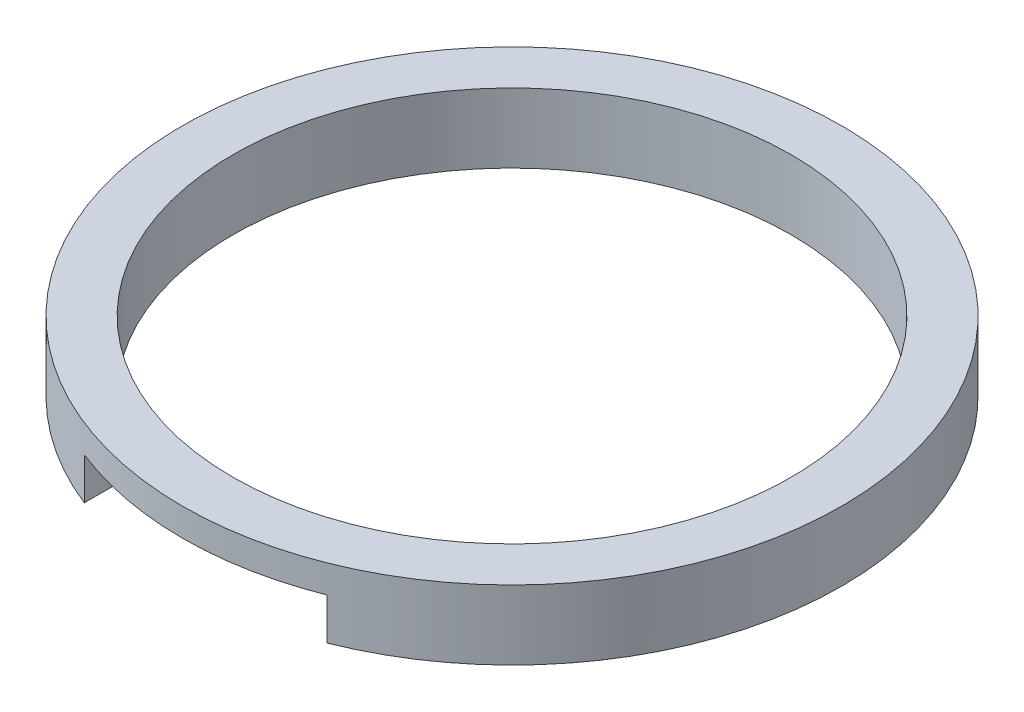
ISO-10303-21;
HEADER;
FILE_DESCRIPTION(('STEP AP214'),'2;1');
FILE_NAME('part.step','',(''),(''),'','','');
FILE_SCHEMA(('AUTOMOTIVE_DESIGN { 1 0 10303 214 1 1 1 1 }'));
ENDSEC;
DATA;
#1=APPLICATION_CONTEXT('core data for automotive mechanical design processes');
#2=APPLICATION_PROTOCOL_DEFINITION('international standard','automotive_design',2000,#1);
#3=PRODUCT_CONTEXT('',#1,'mechanical');
#4=PRODUCT('Part','Part','',(#3));
#5=PRODUCT_RELATED_PRODUCT_CATEGORY('part','',(#4));
#6=PRODUCT_DEFINITION_FORMATION('','',#4);
#7=PRODUCT_DEFINITION_CONTEXT('part definition',#1,'design');
#8=PRODUCT_DEFINITION('design','',#6,#7);
#9=PRODUCT_DEFINITION_SHAPE('','',#8);
#10=(LENGTH_UNIT() NAMED_UNIT(*) SI_UNIT(.MILLI.,.METRE.));
#11=(NAMED_UNIT(*) PLANE_ANGLE_UNIT() SI_UNIT($,.RADIAN.));
#12=(NAMED_UNIT(*) SI_UNIT($,.STERADIAN.) SOLID_ANGLE_UNIT());
#13=UNCERTAINTY_MEASURE_WITH_UNIT(LENGTH_MEASURE(1.E-05),#10,'distance_accuracy_value','');
#14=(GEOMETRIC_REPRESENTATION_CONTEXT(3) GLOBAL_UNCERTAINTY_ASSIGNED_CONTEXT((#13)) GLOBAL_UNIT_ASSIGNED_CONTEXT((#10,
#11,#12)) REPRESENTATION_CONTEXT('',''));
#15=CARTESIAN_POINT('',(0.,0.,0.));
#16=DIRECTION('',(0.,0.,1.));
#17=DIRECTION('',(1.,0.,0.));
#18=AXIS2_PLACEMENT_3D('',#15,#16,#17);
#19=CARTESIAN_POINT('',(0.,2.,0.));
#20=DIRECTION('',(0.,-1.,0.));
#21=DIRECTION('',(0.,0.,-1.));
#22=AXIS2_PLACEMENT_3D('',#19,#20,#21);
#23=CYLINDRICAL_SURFACE('',#22,9.5);
#24=CARTESIAN_POINT('',(0.,2.,0.));
#25=DIRECTION('',(0.,1.,0.));
#26=DIRECTION('',(0.,0.,1.));
#27=AXIS2_PLACEMENT_3D('',#24,#25,#26);
#28=CIRCLE('',#27,9.5);
#29=CARTESIAN_POINT('',(0.,2.,9.5));
#30=VERTEX_POINT('',#29);
#31=EDGE_CURVE('E11',#30,#30,#28,.T.);
#32=ORIENTED_EDGE('',*,*,#31,.F.);
#33=EDGE_LOOP('',(#32));
#34=FACE_BOUND('',#33,.T.);
#35=CARTESIAN_POINT('',(0.,1.2,0.));
#36=DIRECTION('',(0.,-1.,0.));
#37=DIRECTION('',(0.,0.,-1.));
#38=AXIS2_PLACEMENT_3D('',#35,#36,#37);
#39=CIRCLE('',#38,9.5);
#40=CARTESIAN_POINT('',(3.5,1.2,8.83176086632785));
#41=VERTEX_POINT('',#40);
#42=CARTESIAN_POINT('',(-3.5,1.2,8.83176086632785));
#43=VERTEX_POINT('',#42);
#44=EDGE_CURVE('E81',#41,#43,#39,.T.);
#45=ORIENTED_EDGE('',*,*,#44,.F.);
#46=DIRECTION('',(0.,-1.,0.));
#47=VECTOR('',#46,1.);
#48=CARTESIAN_POINT('',(3.5,1.2,8.83176086632785));
#49=LINE('',#48,#47);
#50=CARTESIAN_POINT('',(3.5,0.,8.83176086632785));
#51=VERTEX_POINT('',#50);
#52=EDGE_CURVE('E55',#41,#51,#49,.T.);
#53=ORIENTED_EDGE('',*,*,#52,.T.);
#54=CARTESIAN_POINT('',(0.,0.,0.));
#55=DIRECTION('',(0.,1.,0.));
#56=DIRECTION('',(0.,0.,1.));
#57=AXIS2_PLACEMENT_3D('',#54,#55,#56);
#58=CIRCLE('',#57,9.5);
#59=CARTESIAN_POINT('',(-3.5,0.,8.83176086632785));
#60=VERTEX_POINT('',#59);
#61=EDGE_CURVE('E35',#51,#60,#58,.T.);
#62=ORIENTED_EDGE('',*,*,#61,.T.);
#63=DIRECTION('',(0.,-1.,0.));
#64=VECTOR('',#63,1.);
#65=CARTESIAN_POINT('',(-3.5,1.2,8.83176086632785));
#66=LINE('',#65,#64);
#67=EDGE_CURVE('E75',#43,#60,#66,.T.);
#68=ORIENTED_EDGE('',*,*,#67,.F.);
#69=EDGE_LOOP('',(#45,#53,#62,#68));
#70=FACE_BOUND('',#69,.T.);
#71=ADVANCED_FACE('F32',(#34,#70),#23,.T.);
#72=CARTESIAN_POINT('',(0.,2.,0.));
#73=DIRECTION('',(0.,1.,0.));
#74=DIRECTION('',(0.,0.,1.));
#75=AXIS2_PLACEMENT_3D('',#72,#73,#74);
#76=PLANE('',#75);
#77=CARTESIAN_POINT('',(0.,2.,0.));
#78=DIRECTION('',(0.,1.,0.));
#79=DIRECTION('',(0.,0.,1.));
#80=AXIS2_PLACEMENT_3D('',#77,#78,#79);
#81=CIRCLE('',#80,8.05);
#82=CARTESIAN_POINT('',(0.,2.,8.05));
#83=VERTEX_POINT('',#82);
#84=EDGE_CURVE('E99',#83,#83,#81,.T.);
#85=ORIENTED_EDGE('',*,*,#84,.F.);
#86=EDGE_LOOP('',(#85));
#87=FACE_BOUND('',#86,.T.);
#88=ORIENTED_EDGE('',*,*,#31,.T.);
#89=EDGE_LOOP('',(#88));
#90=FACE_BOUND('',#89,.T.);
#91=ADVANCED_FACE('F116',(#87,#90),#76,.T.);
#92=CARTESIAN_POINT('',(0.,0.,0.));
#93=DIRECTION('',(0.,1.,0.));
#94=DIRECTION('',(0.,0.,1.));
#95=AXIS2_PLACEMENT_3D('',#92,#93,#94);
#96=PLANE('',#95);
#97=ORIENTED_EDGE('',*,*,#61,.F.);
#98=DIRECTION('',(0.,0.,1.));
#99=VECTOR('',#98,1.);
#100=CARTESIAN_POINT('',(3.5,0.,7.24931031202279));
#101=LINE('',#100,#99);
#102=CARTESIAN_POINT('',(3.5,0.,7.24931031202279));
#103=VERTEX_POINT('',#102);
#104=EDGE_CURVE('E71',#103,#51,#101,.T.);
#105=ORIENTED_EDGE('',*,*,#104,.F.);
#106=CARTESIAN_POINT('',(0.,0.,0.));
#107=DIRECTION('',(0.,1.,0.));
#108=DIRECTION('',(0.,0.,1.));
#109=AXIS2_PLACEMENT_3D('',#106,#107,#108);
#110=CIRCLE('',#109,8.05);
#111=CARTESIAN_POINT('',(-3.5,0.,7.24931031202279));
#112=VERTEX_POINT('',#111);
#113=EDGE_CURVE('E96',#103,#112,#110,.T.);
#114=ORIENTED_EDGE('',*,*,#113,.T.);
#115=DIRECTION('',(0.,0.,-1.));
#116=VECTOR('',#115,1.);
#117=CARTESIAN_POINT('',(-3.5,0.,7.24931031202279));
#118=LINE('',#117,#116);
#119=EDGE_CURVE('E106',#60,#112,#118,.T.);
#120=ORIENTED_EDGE('',*,*,#119,.F.);
#121=EDGE_LOOP('',(#97,#105,#114,#120));
#122=FACE_BOUND('',#121,.T.);
#123=ADVANCED_FACE('F114',(#122),#96,.F.);
#124=CARTESIAN_POINT('',(0.,0.,0.));
#125=DIRECTION('',(0.,1.,0.));
#126=DIRECTION('',(0.,0.,1.));
#127=AXIS2_PLACEMENT_3D('',#124,#125,#126);
#128=CYLINDRICAL_SURFACE('',#127,8.05);
#129=ORIENTED_EDGE('',*,*,#113,.F.);
#130=DIRECTION('',(0.,-1.,0.));
#131=VECTOR('',#130,1.);
#132=CARTESIAN_POINT('',(3.5,1.2,7.24931031202279));
#133=LINE('',#132,#131);
#134=CARTESIAN_POINT('',(3.5,1.2,7.24931031202279));
#135=VERTEX_POINT('',#134);
#136=EDGE_CURVE('E91',#135,#103,#133,.T.);
#137=ORIENTED_EDGE('',*,*,#136,.F.);
#138=CARTESIAN_POINT('',(0.,1.2,0.));
#139=DIRECTION('',(0.,1.,0.));
#140=DIRECTION('',(0.,0.,-1.));
#141=AXIS2_PLACEMENT_3D('',#138,#139,#140);
#142=CIRCLE('',#141,8.05);
#143=CARTESIAN_POINT('',(-3.5,1.2,7.24931031202279));
#144=VERTEX_POINT('',#143);
#145=EDGE_CURVE('E80',#144,#135,#142,.T.);
#146=ORIENTED_EDGE('',*,*,#145,.F.);
#147=DIRECTION('',(0.,-1.,0.));
#148=VECTOR('',#147,1.);
#149=CARTESIAN_POINT('',(-3.5,1.2,7.24931031202279));
#150=LINE('',#149,#148);
#151=EDGE_CURVE('E78',#144,#112,#150,.T.);
#152=ORIENTED_EDGE('',*,*,#151,.T.);
#153=EDGE_LOOP('',(#129,#137,#146,#152));
#154=FACE_BOUND('',#153,.T.);
#155=ORIENTED_EDGE('',*,*,#84,.T.);
#156=EDGE_LOOP('',(#155));
#157=FACE_BOUND('',#156,.T.);
#158=ADVANCED_FACE('F112',(#154,#157),#128,.F.);
#159=CARTESIAN_POINT('',(3.5,1.2,7.24931031202279));
#160=DIRECTION('',(1.,0.,0.));
#161=DIRECTION('',(0.,0.,-1.));
#162=AXIS2_PLACEMENT_3D('',#159,#160,#161);
#163=PLANE('',#162);
#164=ORIENTED_EDGE('',*,*,#104,.T.);
#165=ORIENTED_EDGE('',*,*,#52,.F.);
#166=DIRECTION('',(0.,0.,1.));
#167=VECTOR('',#166,1.);
#168=CARTESIAN_POINT('',(3.5,1.2,7.24931031202279));
#169=LINE('',#168,#167);
#170=EDGE_CURVE('E85',#135,#41,#169,.T.);
#171=ORIENTED_EDGE('',*,*,#170,.F.);
#172=ORIENTED_EDGE('',*,*,#136,.T.);
#173=EDGE_LOOP('',(#164,#165,#171,#172));
#174=FACE_BOUND('',#173,.T.);
#175=ADVANCED_FACE('F110',(#174),#163,.F.);
#176=CARTESIAN_POINT('',(-3.5,1.2,7.24931031202279));
#177=DIRECTION('',(-1.,0.,0.));
#178=DIRECTION('',(0.,0.,1.));
#179=AXIS2_PLACEMENT_3D('',#176,#177,#178);
#180=PLANE('',#179);
#181=ORIENTED_EDGE('',*,*,#119,.T.);
#182=ORIENTED_EDGE('',*,*,#151,.F.);
#183=DIRECTION('',(0.,0.,-1.));
#184=VECTOR('',#183,1.);
#185=CARTESIAN_POINT('',(-3.5,1.2,7.24931031202279));
#186=LINE('',#185,#184);
#187=EDGE_CURVE('E46',#43,#144,#186,.T.);
#188=ORIENTED_EDGE('',*,*,#187,.F.);
#189=ORIENTED_EDGE('',*,*,#67,.T.);
#190=EDGE_LOOP('',(#181,#182,#188,#189));
#191=FACE_BOUND('',#190,.T.);
#192=ADVANCED_FACE('F73',(#191),#180,.F.);
#193=CARTESIAN_POINT('',(0.,1.2,0.));
#194=DIRECTION('',(0.,-1.,0.));
#195=DIRECTION('',(0.,0.,-1.));
#196=AXIS2_PLACEMENT_3D('',#193,#194,#195);
#197=PLANE('',#196);
#198=ORIENTED_EDGE('',*,*,#44,.T.);
#199=ORIENTED_EDGE('',*,*,#187,.T.);
#200=ORIENTED_EDGE('',*,*,#145,.T.);
#201=ORIENTED_EDGE('',*,*,#170,.T.);
#202=EDGE_LOOP('',(#198,#199,#200,#201));
#203=FACE_BOUND('',#202,.T.);
#204=ADVANCED_FACE('F84',(#203),#197,.T.);
#205=CLOSED_SHELL('',(#71,#91,#123,#158,#175,#192,#204));
#206=MANIFOLD_SOLID_BREP('B2',#205);
#207=ADVANCED_BREP_SHAPE_REPRESENTATION('',(#18,#206),#14);
#208=SHAPE_DEFINITION_REPRESENTATION(#9,#207);
ENDSEC;
END-ISO-10303-21;
